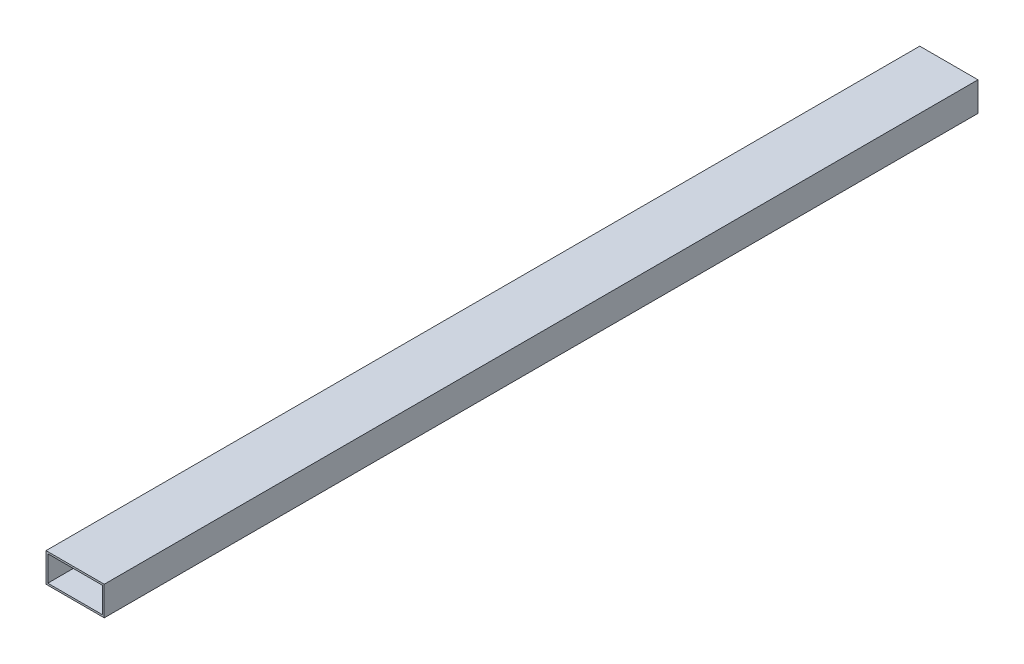
ISO-10303-21;
HEADER;
FILE_DESCRIPTION(('STEP AP214'),'2;1');
FILE_NAME('part.step','',(''),(''),'','','');
FILE_SCHEMA(('AUTOMOTIVE_DESIGN { 1 0 10303 214 1 1 1 1 }'));
ENDSEC;
DATA;
#1=APPLICATION_CONTEXT('core data for automotive mechanical design processes');
#2=APPLICATION_PROTOCOL_DEFINITION('international standard','automotive_design',2000,#1);
#3=PRODUCT_CONTEXT('',#1,'mechanical');
#4=PRODUCT('Part','Part','',(#3));
#5=PRODUCT_RELATED_PRODUCT_CATEGORY('part','',(#4));
#6=PRODUCT_DEFINITION_FORMATION('','',#4);
#7=PRODUCT_DEFINITION_CONTEXT('part definition',#1,'design');
#8=PRODUCT_DEFINITION('design','',#6,#7);
#9=PRODUCT_DEFINITION_SHAPE('','',#8);
#10=(LENGTH_UNIT() NAMED_UNIT(*) SI_UNIT(.MILLI.,.METRE.));
#11=(NAMED_UNIT(*) PLANE_ANGLE_UNIT() SI_UNIT($,.RADIAN.));
#12=(NAMED_UNIT(*) SI_UNIT($,.STERADIAN.) SOLID_ANGLE_UNIT());
#13=UNCERTAINTY_MEASURE_WITH_UNIT(LENGTH_MEASURE(1.E-05),#10,'distance_accuracy_value','');
#14=(GEOMETRIC_REPRESENTATION_CONTEXT(3) GLOBAL_UNCERTAINTY_ASSIGNED_CONTEXT((#13)) GLOBAL_UNIT_ASSIGNED_CONTEXT((#10,
#11,#12)) REPRESENTATION_CONTEXT('',''));
#15=CARTESIAN_POINT('',(0.,0.,0.));
#16=DIRECTION('',(0.,0.,1.));
#17=DIRECTION('',(1.,0.,0.));
#18=AXIS2_PLACEMENT_3D('',#15,#16,#17);
#19=CARTESIAN_POINT('',(0.,0.,762.));
#20=DIRECTION('',(0.,0.,1.));
#21=DIRECTION('',(1.,0.,0.));
#22=AXIS2_PLACEMENT_3D('',#19,#20,#21);
#23=PLANE('',#22);
#24=DIRECTION('',(0.,-1.,0.));
#25=VECTOR('',#24,1.);
#26=CARTESIAN_POINT('',(-46.8772200772201,18.6332046332046,762.));
#27=LINE('',#26,#25);
#28=CARTESIAN_POINT('',(-46.8772200772201,18.6332046332046,762.));
#29=VERTEX_POINT('',#28);
#30=CARTESIAN_POINT('',(-46.8772200772201,-6.76679536679537,762.));
#31=VERTEX_POINT('',#30);
#32=EDGE_CURVE('E177',#29,#31,#27,.T.);
#33=ORIENTED_EDGE('',*,*,#32,.T.);
#34=DIRECTION('',(1.,0.,0.));
#35=VECTOR('',#34,1.);
#36=CARTESIAN_POINT('',(-46.8772200772201,-6.76679536679537,762.));
#37=LINE('',#36,#35);
#38=CARTESIAN_POINT('',(3.92277992277993,-6.76679536679537,762.));
#39=VERTEX_POINT('',#38);
#40=EDGE_CURVE('E181',#31,#39,#37,.T.);
#41=ORIENTED_EDGE('',*,*,#40,.T.);
#42=DIRECTION('',(0.,1.,0.));
#43=VECTOR('',#42,1.);
#44=CARTESIAN_POINT('',(3.92277992277993,18.6332046332046,762.));
#45=LINE('',#44,#43);
#46=CARTESIAN_POINT('',(3.92277992277993,18.6332046332046,762.));
#47=VERTEX_POINT('',#46);
#48=EDGE_CURVE('E185',#39,#47,#45,.T.);
#49=ORIENTED_EDGE('',*,*,#48,.T.);
#50=DIRECTION('',(-1.,0.,0.));
#51=VECTOR('',#50,1.);
#52=CARTESIAN_POINT('',(-46.8772200772201,18.6332046332046,762.));
#53=LINE('',#52,#51);
#54=EDGE_CURVE('E188',#47,#29,#53,.T.);
#55=ORIENTED_EDGE('',*,*,#54,.T.);
#56=EDGE_LOOP('',(#33,#41,#49,#55));
#57=FACE_BOUND('',#56,.T.);
#58=DIRECTION('',(1.,0.,0.));
#59=VECTOR('',#58,1.);
#60=CARTESIAN_POINT('',(-46.8772200772201,-5.19199536679537,762.));
#61=LINE('',#60,#59);
#62=CARTESIAN_POINT('',(-45.3024200772201,-5.19199536679537,762.));
#63=VERTEX_POINT('',#62);
#64=CARTESIAN_POINT('',(2.34797992277993,-5.19199536679537,762.));
#65=VERTEX_POINT('',#64);
#66=EDGE_CURVE('E138',#63,#65,#61,.T.);
#67=ORIENTED_EDGE('',*,*,#66,.F.);
#68=DIRECTION('',(0.,-1.,0.));
#69=VECTOR('',#68,1.);
#70=CARTESIAN_POINT('',(-45.3024200772201,18.6332046332046,762.));
#71=LINE('',#70,#69);
#72=CARTESIAN_POINT('',(-45.3024200772201,17.0584046332046,762.));
#73=VERTEX_POINT('',#72);
#74=EDGE_CURVE('E129',#73,#63,#71,.T.);
#75=ORIENTED_EDGE('',*,*,#74,.F.);
#76=DIRECTION('',(-1.,0.,0.));
#77=VECTOR('',#76,1.);
#78=CARTESIAN_POINT('',(-46.8772200772201,17.0584046332046,762.));
#79=LINE('',#78,#77);
#80=CARTESIAN_POINT('',(2.34797992277993,17.0584046332046,762.));
#81=VERTEX_POINT('',#80);
#82=EDGE_CURVE('E155',#81,#73,#79,.T.);
#83=ORIENTED_EDGE('',*,*,#82,.F.);
#84=DIRECTION('',(0.,1.,0.));
#85=VECTOR('',#84,1.);
#86=CARTESIAN_POINT('',(2.34797992277993,18.6332046332046,762.));
#87=LINE('',#86,#85);
#88=EDGE_CURVE('E151',#65,#81,#87,.T.);
#89=ORIENTED_EDGE('',*,*,#88,.F.);
#90=EDGE_LOOP('',(#67,#75,#83,#89));
#91=FACE_BOUND('',#90,.T.);
#92=ADVANCED_FACE('F63',(#57,#91),#23,.T.);
#93=CARTESIAN_POINT('',(0.,0.,0.));
#94=DIRECTION('',(0.,0.,1.));
#95=DIRECTION('',(1.,0.,0.));
#96=AXIS2_PLACEMENT_3D('',#93,#94,#95);
#97=PLANE('',#96);
#98=DIRECTION('',(0.,-1.,0.));
#99=VECTOR('',#98,1.);
#100=CARTESIAN_POINT('',(-46.8772200772201,18.6332046332046,0.));
#101=LINE('',#100,#99);
#102=CARTESIAN_POINT('',(-46.8772200772201,18.6332046332046,0.));
#103=VERTEX_POINT('',#102);
#104=CARTESIAN_POINT('',(-46.8772200772201,-6.76679536679537,0.));
#105=VERTEX_POINT('',#104);
#106=EDGE_CURVE('E147',#103,#105,#101,.T.);
#107=ORIENTED_EDGE('',*,*,#106,.F.);
#108=DIRECTION('',(-1.,0.,0.));
#109=VECTOR('',#108,1.);
#110=CARTESIAN_POINT('',(-46.8772200772201,18.6332046332046,0.));
#111=LINE('',#110,#109);
#112=CARTESIAN_POINT('',(3.92277992277993,18.6332046332046,0.));
#113=VERTEX_POINT('',#112);
#114=EDGE_CURVE('E182',#113,#103,#111,.T.);
#115=ORIENTED_EDGE('',*,*,#114,.F.);
#116=DIRECTION('',(0.,1.,0.));
#117=VECTOR('',#116,1.);
#118=CARTESIAN_POINT('',(3.92277992277993,18.6332046332046,0.));
#119=LINE('',#118,#117);
#120=CARTESIAN_POINT('',(3.92277992277993,-6.76679536679537,0.));
#121=VERTEX_POINT('',#120);
#122=EDGE_CURVE('E198',#121,#113,#119,.T.);
#123=ORIENTED_EDGE('',*,*,#122,.F.);
#124=DIRECTION('',(1.,0.,0.));
#125=VECTOR('',#124,1.);
#126=CARTESIAN_POINT('',(-46.8772200772201,-6.76679536679537,0.));
#127=LINE('',#126,#125);
#128=EDGE_CURVE('E195',#105,#121,#127,.T.);
#129=ORIENTED_EDGE('',*,*,#128,.F.);
#130=EDGE_LOOP('',(#107,#115,#123,#129));
#131=FACE_BOUND('',#130,.T.);
#132=DIRECTION('',(0.,-1.,0.));
#133=VECTOR('',#132,1.);
#134=CARTESIAN_POINT('',(-45.3024200772201,18.6332046332046,0.));
#135=LINE('',#134,#133);
#136=CARTESIAN_POINT('',(-45.3024200772201,17.0584046332046,0.));
#137=VERTEX_POINT('',#136);
#138=CARTESIAN_POINT('',(-45.3024200772201,-5.19199536679537,0.));
#139=VERTEX_POINT('',#138);
#140=EDGE_CURVE('E87',#137,#139,#135,.T.);
#141=ORIENTED_EDGE('',*,*,#140,.T.);
#142=DIRECTION('',(1.,0.,0.));
#143=VECTOR('',#142,1.);
#144=CARTESIAN_POINT('',(-46.8772200772201,-5.19199536679537,0.));
#145=LINE('',#144,#143);
#146=CARTESIAN_POINT('',(2.34797992277993,-5.19199536679537,0.));
#147=VERTEX_POINT('',#146);
#148=EDGE_CURVE('E145',#139,#147,#145,.T.);
#149=ORIENTED_EDGE('',*,*,#148,.T.);
#150=DIRECTION('',(0.,1.,0.));
#151=VECTOR('',#150,1.);
#152=CARTESIAN_POINT('',(2.34797992277993,18.6332046332046,0.));
#153=LINE('',#152,#151);
#154=CARTESIAN_POINT('',(2.34797992277993,17.0584046332046,0.));
#155=VERTEX_POINT('',#154);
#156=EDGE_CURVE('E164',#147,#155,#153,.T.);
#157=ORIENTED_EDGE('',*,*,#156,.T.);
#158=DIRECTION('',(-1.,0.,0.));
#159=VECTOR('',#158,1.);
#160=CARTESIAN_POINT('',(-46.8772200772201,17.0584046332046,0.));
#161=LINE('',#160,#159);
#162=EDGE_CURVE('E139',#155,#137,#161,.T.);
#163=ORIENTED_EDGE('',*,*,#162,.T.);
#164=EDGE_LOOP('',(#141,#149,#157,#163));
#165=FACE_BOUND('',#164,.T.);
#166=ADVANCED_FACE('F221',(#131,#165),#97,.F.);
#167=CARTESIAN_POINT('',(-46.8772200772201,18.6332046332046,762.));
#168=DIRECTION('',(1.,0.,0.));
#169=DIRECTION('',(0.,1.,0.));
#170=AXIS2_PLACEMENT_3D('',#167,#168,#169);
#171=PLANE('',#170);
#172=ORIENTED_EDGE('',*,*,#106,.T.);
#173=DIRECTION('',(0.,0.,-1.));
#174=VECTOR('',#173,1.);
#175=CARTESIAN_POINT('',(-46.8772200772201,-6.76679536679537,762.));
#176=LINE('',#175,#174);
#177=EDGE_CURVE('E12',#31,#105,#176,.T.);
#178=ORIENTED_EDGE('',*,*,#177,.F.);
#179=ORIENTED_EDGE('',*,*,#32,.F.);
#180=DIRECTION('',(0.,0.,-1.));
#181=VECTOR('',#180,1.);
#182=CARTESIAN_POINT('',(-46.8772200772201,18.6332046332046,762.));
#183=LINE('',#182,#181);
#184=EDGE_CURVE('E191',#29,#103,#183,.T.);
#185=ORIENTED_EDGE('',*,*,#184,.T.);
#186=EDGE_LOOP('',(#172,#178,#179,#185));
#187=FACE_BOUND('',#186,.T.);
#188=ADVANCED_FACE('F65',(#187),#171,.F.);
#189=CARTESIAN_POINT('',(-46.8772200772201,-6.76679536679537,762.));
#190=DIRECTION('',(0.,1.,0.));
#191=DIRECTION('',(0.,0.,1.));
#192=AXIS2_PLACEMENT_3D('',#189,#190,#191);
#193=PLANE('',#192);
#194=ORIENTED_EDGE('',*,*,#128,.T.);
#195=DIRECTION('',(0.,0.,-1.));
#196=VECTOR('',#195,1.);
#197=CARTESIAN_POINT('',(3.92277992277993,-6.76679536679537,762.));
#198=LINE('',#197,#196);
#199=EDGE_CURVE('E72',#39,#121,#198,.T.);
#200=ORIENTED_EDGE('',*,*,#199,.F.);
#201=ORIENTED_EDGE('',*,*,#40,.F.);
#202=ORIENTED_EDGE('',*,*,#177,.T.);
#203=EDGE_LOOP('',(#194,#200,#201,#202));
#204=FACE_BOUND('',#203,.T.);
#205=ADVANCED_FACE('F231',(#204),#193,.F.);
#206=CARTESIAN_POINT('',(3.92277992277993,18.6332046332046,762.));
#207=DIRECTION('',(-1.,0.,0.));
#208=DIRECTION('',(0.,-1.,0.));
#209=AXIS2_PLACEMENT_3D('',#206,#207,#208);
#210=PLANE('',#209);
#211=ORIENTED_EDGE('',*,*,#122,.T.);
#212=DIRECTION('',(0.,0.,-1.));
#213=VECTOR('',#212,1.);
#214=CARTESIAN_POINT('',(3.92277992277993,18.6332046332046,762.));
#215=LINE('',#214,#213);
#216=EDGE_CURVE('E206',#47,#113,#215,.T.);
#217=ORIENTED_EDGE('',*,*,#216,.F.);
#218=ORIENTED_EDGE('',*,*,#48,.F.);
#219=ORIENTED_EDGE('',*,*,#199,.T.);
#220=EDGE_LOOP('',(#211,#217,#218,#219));
#221=FACE_BOUND('',#220,.T.);
#222=ADVANCED_FACE('F215',(#221),#210,.F.);
#223=CARTESIAN_POINT('',(-46.8772200772201,18.6332046332046,762.));
#224=DIRECTION('',(0.,-1.,0.));
#225=DIRECTION('',(0.,0.,-1.));
#226=AXIS2_PLACEMENT_3D('',#223,#224,#225);
#227=PLANE('',#226);
#228=ORIENTED_EDGE('',*,*,#114,.T.);
#229=ORIENTED_EDGE('',*,*,#184,.F.);
#230=ORIENTED_EDGE('',*,*,#54,.F.);
#231=ORIENTED_EDGE('',*,*,#216,.T.);
#232=EDGE_LOOP('',(#228,#229,#230,#231));
#233=FACE_BOUND('',#232,.T.);
#234=ADVANCED_FACE('F225',(#233),#227,.F.);
#235=CARTESIAN_POINT('',(-45.3024200772201,18.6332046332046,762.));
#236=DIRECTION('',(1.,0.,0.));
#237=DIRECTION('',(0.,1.,0.));
#238=AXIS2_PLACEMENT_3D('',#235,#236,#237);
#239=PLANE('',#238);
#240=ORIENTED_EDGE('',*,*,#140,.F.);
#241=DIRECTION('',(0.,0.,-1.));
#242=VECTOR('',#241,1.);
#243=CARTESIAN_POINT('',(-45.3024200772201,17.0584046332046,762.));
#244=LINE('',#243,#242);
#245=EDGE_CURVE('E133',#73,#137,#244,.T.);
#246=ORIENTED_EDGE('',*,*,#245,.F.);
#247=ORIENTED_EDGE('',*,*,#74,.T.);
#248=DIRECTION('',(0.,0.,-1.));
#249=VECTOR('',#248,1.);
#250=CARTESIAN_POINT('',(-45.3024200772201,-5.19199536679537,762.));
#251=LINE('',#250,#249);
#252=EDGE_CURVE('E132',#63,#139,#251,.T.);
#253=ORIENTED_EDGE('',*,*,#252,.T.);
#254=EDGE_LOOP('',(#240,#246,#247,#253));
#255=FACE_BOUND('',#254,.T.);
#256=ADVANCED_FACE('F131',(#255),#239,.T.);
#257=CARTESIAN_POINT('',(-46.8772200772201,-5.19199536679537,762.));
#258=DIRECTION('',(0.,1.,0.));
#259=DIRECTION('',(0.,0.,1.));
#260=AXIS2_PLACEMENT_3D('',#257,#258,#259);
#261=PLANE('',#260);
#262=ORIENTED_EDGE('',*,*,#148,.F.);
#263=ORIENTED_EDGE('',*,*,#252,.F.);
#264=ORIENTED_EDGE('',*,*,#66,.T.);
#265=DIRECTION('',(0.,0.,-1.));
#266=VECTOR('',#265,1.);
#267=CARTESIAN_POINT('',(2.34797992277993,-5.19199536679537,762.));
#268=LINE('',#267,#266);
#269=EDGE_CURVE('E148',#65,#147,#268,.T.);
#270=ORIENTED_EDGE('',*,*,#269,.T.);
#271=EDGE_LOOP('',(#262,#263,#264,#270));
#272=FACE_BOUND('',#271,.T.);
#273=ADVANCED_FACE('F142',(#272),#261,.T.);
#274=CARTESIAN_POINT('',(2.34797992277993,18.6332046332046,762.));
#275=DIRECTION('',(-1.,0.,0.));
#276=DIRECTION('',(0.,-1.,0.));
#277=AXIS2_PLACEMENT_3D('',#274,#275,#276);
#278=PLANE('',#277);
#279=ORIENTED_EDGE('',*,*,#156,.F.);
#280=ORIENTED_EDGE('',*,*,#269,.F.);
#281=ORIENTED_EDGE('',*,*,#88,.T.);
#282=DIRECTION('',(0.,0.,-1.));
#283=VECTOR('',#282,1.);
#284=CARTESIAN_POINT('',(2.34797992277993,17.0584046332046,762.));
#285=LINE('',#284,#283);
#286=EDGE_CURVE('E79',#81,#155,#285,.T.);
#287=ORIENTED_EDGE('',*,*,#286,.T.);
#288=EDGE_LOOP('',(#279,#280,#281,#287));
#289=FACE_BOUND('',#288,.T.);
#290=ADVANCED_FACE('F254',(#289),#278,.T.);
#291=CARTESIAN_POINT('',(-46.8772200772201,17.0584046332046,762.));
#292=DIRECTION('',(0.,-1.,0.));
#293=DIRECTION('',(0.,0.,-1.));
#294=AXIS2_PLACEMENT_3D('',#291,#292,#293);
#295=PLANE('',#294);
#296=ORIENTED_EDGE('',*,*,#162,.F.);
#297=ORIENTED_EDGE('',*,*,#286,.F.);
#298=ORIENTED_EDGE('',*,*,#82,.T.);
#299=ORIENTED_EDGE('',*,*,#245,.T.);
#300=EDGE_LOOP('',(#296,#297,#298,#299));
#301=FACE_BOUND('',#300,.T.);
#302=ADVANCED_FACE('F258',(#301),#295,.T.);
#303=CLOSED_SHELL('',(#92,#166,#188,#205,#222,#234,#256,#273,#290,#302));
#304=MANIFOLD_SOLID_BREP('B2',#303);
#305=ADVANCED_BREP_SHAPE_REPRESENTATION('',(#18,#304),#14);
#306=SHAPE_DEFINITION_REPRESENTATION(#9,#305);
ENDSEC;
END-ISO-10303-21;
